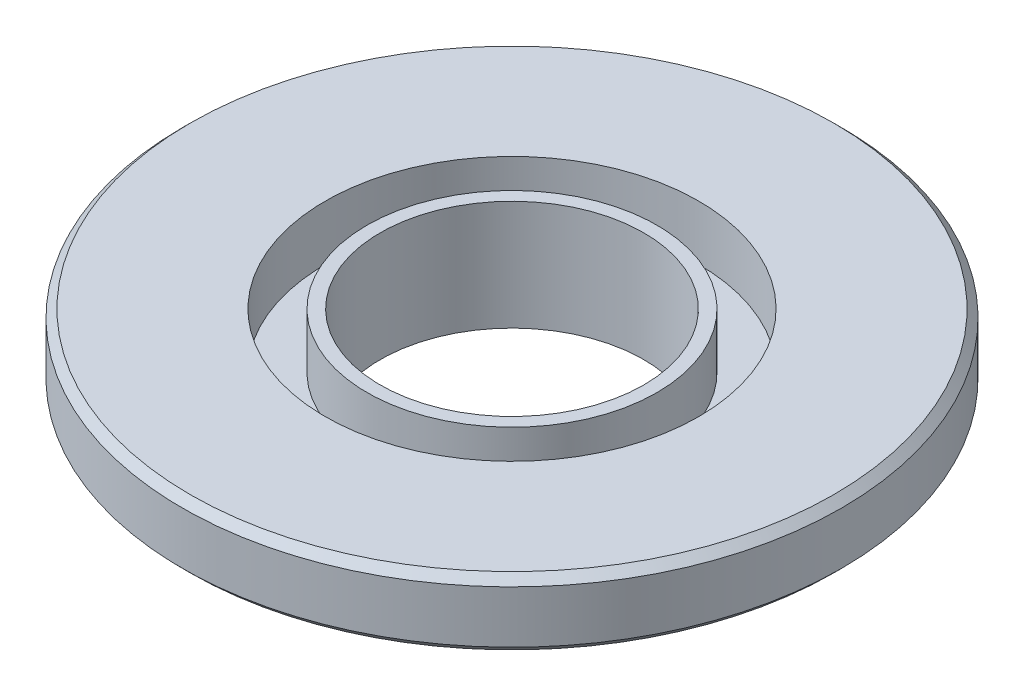
ISO-10303-21;
HEADER;
FILE_DESCRIPTION(('STEP AP214'),'2;1');
FILE_NAME('part.step','',(''),(''),'','','');
FILE_SCHEMA(('AUTOMOTIVE_DESIGN { 1 0 10303 214 1 1 1 1 }'));
ENDSEC;
DATA;
#1=APPLICATION_CONTEXT('core data for automotive mechanical design processes');
#2=APPLICATION_PROTOCOL_DEFINITION('international standard','automotive_design',2000,#1);
#3=PRODUCT_CONTEXT('',#1,'mechanical');
#4=PRODUCT('Part','Part','',(#3));
#5=PRODUCT_RELATED_PRODUCT_CATEGORY('part','',(#4));
#6=PRODUCT_DEFINITION_FORMATION('','',#4);
#7=PRODUCT_DEFINITION_CONTEXT('part definition',#1,'design');
#8=PRODUCT_DEFINITION('design','',#6,#7);
#9=PRODUCT_DEFINITION_SHAPE('','',#8);
#10=(LENGTH_UNIT() NAMED_UNIT(*) SI_UNIT(.MILLI.,.METRE.));
#11=(NAMED_UNIT(*) PLANE_ANGLE_UNIT() SI_UNIT($,.RADIAN.));
#12=(NAMED_UNIT(*) SI_UNIT($,.STERADIAN.) SOLID_ANGLE_UNIT());
#13=UNCERTAINTY_MEASURE_WITH_UNIT(LENGTH_MEASURE(1.E-05),#10,'distance_accuracy_value','');
#14=(GEOMETRIC_REPRESENTATION_CONTEXT(3) GLOBAL_UNCERTAINTY_ASSIGNED_CONTEXT((#13)) GLOBAL_UNIT_ASSIGNED_CONTEXT((#10,
#11,#12)) REPRESENTATION_CONTEXT('',''));
#15=CARTESIAN_POINT('',(0.,0.,0.));
#16=DIRECTION('',(0.,0.,1.));
#17=DIRECTION('',(1.,0.,0.));
#18=AXIS2_PLACEMENT_3D('',#15,#16,#17);
#19=CARTESIAN_POINT('',(0.,-0.1767766952966,0.));
#20=DIRECTION('',(0.,-1.,0.));
#21=DIRECTION('',(-1.,0.,0.));
#22=AXIS2_PLACEMENT_3D('',#19,#20,#21);
#23=CONICAL_SURFACE('',#22,14.8232233047,0.785398163397448);
#24=CARTESIAN_POINT('',(0.,-0.3535533905933,0.));
#25=DIRECTION('',(0.,-1.,0.));
#26=DIRECTION('',(1.,0.,0.));
#27=AXIS2_PLACEMENT_3D('',#24,#25,#26);
#28=CIRCLE('',#27,15.);
#29=CARTESIAN_POINT('',(15.,-0.3535533905933,0.));
#30=VERTEX_POINT('',#29);
#31=EDGE_CURVE('E27',#30,#30,#28,.T.);
#32=ORIENTED_EDGE('',*,*,#31,.F.);
#33=DIRECTION('',(-0.707106781186548,0.707106781186548,0.));
#34=VECTOR('',#33,1.);
#35=CARTESIAN_POINT('',(14.8232233047,-0.1767766952966,0.));
#36=LINE('',#35,#34);
#37=CARTESIAN_POINT('',(14.6464466094067,-3.29299087997725E-12,0.));
#38=VERTEX_POINT('',#37);
#39=EDGE_CURVE('E11',#30,#38,#36,.T.);
#40=ORIENTED_EDGE('',*,*,#39,.T.);
#41=CARTESIAN_POINT('',(0.,0.,0.));
#42=DIRECTION('',(0.,1.,0.));
#43=DIRECTION('',(1.,0.,0.));
#44=AXIS2_PLACEMENT_3D('',#41,#42,#43);
#45=CIRCLE('',#44,14.64644660941);
#46=EDGE_CURVE('E123',#38,#38,#45,.T.);
#47=ORIENTED_EDGE('',*,*,#46,.F.);
#48=ORIENTED_EDGE('',*,*,#39,.F.);
#49=EDGE_LOOP('',(#32,#40,#47,#48));
#50=FACE_BOUND('',#49,.T.);
#51=ADVANCED_FACE('F17',(#50),#23,.T.);
#52=CARTESIAN_POINT('',(0.,0.25,0.));
#53=DIRECTION('',(0.,-1.,0.));
#54=DIRECTION('',(-1.,0.,0.));
#55=AXIS2_PLACEMENT_3D('',#52,#53,#54);
#56=CYLINDRICAL_SURFACE('',#55,15.);
#57=CARTESIAN_POINT('',(0.,-2.731562011664,0.));
#58=DIRECTION('',(0.,-1.,0.));
#59=DIRECTION('',(1.,0.,0.));
#60=AXIS2_PLACEMENT_3D('',#57,#58,#59);
#61=CIRCLE('',#60,15.);
#62=CARTESIAN_POINT('',(-15.,-2.731562011664,0.));
#63=VERTEX_POINT('',#62);
#64=CARTESIAN_POINT('',(15.,-2.731562011664,0.));
#65=VERTEX_POINT('',#64);
#66=EDGE_CURVE('E98',#63,#65,#61,.T.);
#67=ORIENTED_EDGE('',*,*,#66,.F.);
#68=CARTESIAN_POINT('',(0.,-2.731562011664,0.));
#69=DIRECTION('',(0.,-1.,0.));
#70=DIRECTION('',(1.,0.,0.));
#71=AXIS2_PLACEMENT_3D('',#68,#69,#70);
#72=CIRCLE('',#71,15.);
#73=EDGE_CURVE('E92',#65,#63,#72,.T.);
#74=ORIENTED_EDGE('',*,*,#73,.F.);
#75=DIRECTION('',(0.,1.,0.));
#76=VECTOR('',#75,1.);
#77=CARTESIAN_POINT('',(15.,0.25,0.));
#78=LINE('',#77,#76);
#79=EDGE_CURVE('E49',#65,#30,#78,.T.);
#80=ORIENTED_EDGE('',*,*,#79,.T.);
#81=ORIENTED_EDGE('',*,*,#31,.T.);
#82=ORIENTED_EDGE('',*,*,#79,.F.);
#83=EDGE_LOOP('',(#67,#74,#80,#81,#82));
#84=FACE_BOUND('',#83,.T.);
#85=ADVANCED_FACE('F151',(#84),#56,.T.);
#86=CARTESIAN_POINT('',(0.,-2.908338706961,0.));
#87=DIRECTION('',(0.,1.,0.));
#88=DIRECTION('',(1.,0.,0.));
#89=AXIS2_PLACEMENT_3D('',#86,#87,#88);
#90=CONICAL_SURFACE('',#89,14.8232233047,0.785398163397448);
#91=ORIENTED_EDGE('',*,*,#66,.T.);
#92=ORIENTED_EDGE('',*,*,#73,.T.);
#93=DIRECTION('',(0.707106781186548,-0.707106781186548,0.));
#94=VECTOR('',#93,1.);
#95=CARTESIAN_POINT('',(-14.8232233047,-2.908338706961,0.));
#96=LINE('',#95,#94);
#97=CARTESIAN_POINT('',(-14.64644660941,-3.085115402257,0.));
#98=VERTEX_POINT('',#97);
#99=EDGE_CURVE('E88',#63,#98,#96,.T.);
#100=ORIENTED_EDGE('',*,*,#99,.T.);
#101=CARTESIAN_POINT('',(0.,-3.085115402257,0.));
#102=DIRECTION('',(0.,-1.,0.));
#103=DIRECTION('',(1.,0.,0.));
#104=AXIS2_PLACEMENT_3D('',#101,#102,#103);
#105=CIRCLE('',#104,14.64644660941);
#106=EDGE_CURVE('E91',#98,#98,#105,.T.);
#107=ORIENTED_EDGE('',*,*,#106,.F.);
#108=ORIENTED_EDGE('',*,*,#99,.F.);
#109=EDGE_LOOP('',(#91,#92,#100,#107,#108));
#110=FACE_BOUND('',#109,.T.);
#111=ADVANCED_FACE('F90',(#110),#90,.T.);
#112=CARTESIAN_POINT('',(0.,-4.042557701129,0.));
#113=DIRECTION('',(0.,1.,0.));
#114=DIRECTION('',(1.,0.,0.));
#115=AXIS2_PLACEMENT_3D('',#112,#113,#114);
#116=CONICAL_SURFACE('',#115,11.0732233047,1.30899693899575);
#117=ORIENTED_EDGE('',*,*,#106,.T.);
#118=DIRECTION('',(0.965925826289068,-0.258819045102521,0.));
#119=VECTOR('',#118,1.);
#120=CARTESIAN_POINT('',(-11.0732233047,-4.042557701129,0.));
#121=LINE('',#120,#119);
#122=CARTESIAN_POINT('',(-7.5,-5.,0.));
#123=VERTEX_POINT('',#122);
#124=EDGE_CURVE('E80',#98,#123,#121,.T.);
#125=ORIENTED_EDGE('',*,*,#124,.T.);
#126=CARTESIAN_POINT('',(0.,-5.,0.));
#127=DIRECTION('',(0.,-1.,0.));
#128=DIRECTION('',(1.,0.,0.));
#129=AXIS2_PLACEMENT_3D('',#126,#127,#128);
#130=CIRCLE('',#129,7.5);
#131=EDGE_CURVE('E96',#123,#123,#130,.T.);
#132=ORIENTED_EDGE('',*,*,#131,.F.);
#133=ORIENTED_EDGE('',*,*,#124,.F.);
#134=EDGE_LOOP('',(#117,#125,#132,#133));
#135=FACE_BOUND('',#134,.T.);
#136=ADVANCED_FACE('F95',(#135),#116,.T.);
#137=CARTESIAN_POINT('',(0.,-5.,0.));
#138=DIRECTION('',(0.,-1.,0.));
#139=DIRECTION('',(0.,0.,-1.));
#140=AXIS2_PLACEMENT_3D('',#137,#138,#139);
#141=PLANE('',#140);
#142=CARTESIAN_POINT('',(0.,-5.,0.));
#143=DIRECTION('',(0.,-1.,0.));
#144=DIRECTION('',(1.,0.,0.));
#145=AXIS2_PLACEMENT_3D('',#142,#143,#144);
#146=CIRCLE('',#145,6.);
#147=CARTESIAN_POINT('',(6.,-5.,0.));
#148=VERTEX_POINT('',#147);
#149=EDGE_CURVE('E110',#148,#148,#146,.T.);
#150=ORIENTED_EDGE('',*,*,#149,.F.);
#151=EDGE_LOOP('',(#150));
#152=FACE_BOUND('',#151,.T.);
#153=ORIENTED_EDGE('',*,*,#131,.T.);
#154=EDGE_LOOP('',(#153));
#155=FACE_BOUND('',#154,.T.);
#156=ADVANCED_FACE('F19',(#152,#155),#141,.T.);
#157=CARTESIAN_POINT('',(0.,0.25,0.));
#158=DIRECTION('',(0.,-1.,0.));
#159=DIRECTION('',(-1.,0.,0.));
#160=AXIS2_PLACEMENT_3D('',#157,#158,#159);
#161=CYLINDRICAL_SURFACE('',#160,6.);
#162=CARTESIAN_POINT('',(0.,0.,0.));
#163=DIRECTION('',(0.,-1.,0.));
#164=DIRECTION('',(1.,0.,0.));
#165=AXIS2_PLACEMENT_3D('',#162,#163,#164);
#166=CIRCLE('',#165,6.);
#167=CARTESIAN_POINT('',(6.,0.,0.));
#168=VERTEX_POINT('',#167);
#169=EDGE_CURVE('E190',#168,#168,#166,.T.);
#170=ORIENTED_EDGE('',*,*,#169,.F.);
#171=DIRECTION('',(0.,-1.,0.));
#172=VECTOR('',#171,1.);
#173=CARTESIAN_POINT('',(6.,0.25,0.));
#174=LINE('',#173,#172);
#175=EDGE_CURVE('E113',#168,#148,#174,.T.);
#176=ORIENTED_EDGE('',*,*,#175,.T.);
#177=ORIENTED_EDGE('',*,*,#149,.T.);
#178=ORIENTED_EDGE('',*,*,#175,.F.);
#179=EDGE_LOOP('',(#170,#176,#177,#178));
#180=FACE_BOUND('',#179,.T.);
#181=ADVANCED_FACE('F139',(#180),#161,.F.);
#182=CARTESIAN_POINT('',(0.,0.,0.));
#183=DIRECTION('',(0.,-1.,0.));
#184=DIRECTION('',(0.,0.,-1.));
#185=AXIS2_PLACEMENT_3D('',#182,#183,#184);
#186=PLANE('',#185);
#187=ORIENTED_EDGE('',*,*,#169,.T.);
#188=EDGE_LOOP('',(#187));
#189=FACE_BOUND('',#188,.T.);
#190=CARTESIAN_POINT('',(0.,0.,0.));
#191=DIRECTION('',(0.,-1.,0.));
#192=DIRECTION('',(1.,0.,0.));
#193=AXIS2_PLACEMENT_3D('',#190,#191,#192);
#194=CIRCLE('',#193,6.6);
#195=CARTESIAN_POINT('',(6.6,0.,0.));
#196=VERTEX_POINT('',#195);
#197=EDGE_CURVE('E188',#196,#196,#194,.T.);
#198=ORIENTED_EDGE('',*,*,#197,.F.);
#199=EDGE_LOOP('',(#198));
#200=FACE_BOUND('',#199,.T.);
#201=ADVANCED_FACE('F146',(#189,#200),#186,.F.);
#202=CARTESIAN_POINT('',(0.,0.25,0.));
#203=DIRECTION('',(0.,-1.,0.));
#204=DIRECTION('',(-1.,0.,0.));
#205=AXIS2_PLACEMENT_3D('',#202,#203,#204);
#206=CYLINDRICAL_SURFACE('',#205,6.6);
#207=CARTESIAN_POINT('',(0.,-2.5,0.));
#208=DIRECTION('',(0.,-1.,0.));
#209=DIRECTION('',(1.,0.,0.));
#210=AXIS2_PLACEMENT_3D('',#207,#208,#209);
#211=CIRCLE('',#210,6.6);
#212=CARTESIAN_POINT('',(6.6,-2.5,0.));
#213=VERTEX_POINT('',#212);
#214=EDGE_CURVE('E21',#213,#213,#211,.T.);
#215=ORIENTED_EDGE('',*,*,#214,.F.);
#216=DIRECTION('',(0.,1.,0.));
#217=VECTOR('',#216,1.);
#218=CARTESIAN_POINT('',(6.6,0.25,0.));
#219=LINE('',#218,#217);
#220=EDGE_CURVE('E132',#213,#196,#219,.T.);
#221=ORIENTED_EDGE('',*,*,#220,.T.);
#222=ORIENTED_EDGE('',*,*,#197,.T.);
#223=ORIENTED_EDGE('',*,*,#220,.F.);
#224=EDGE_LOOP('',(#215,#221,#222,#223));
#225=FACE_BOUND('',#224,.T.);
#226=ADVANCED_FACE('F164',(#225),#206,.T.);
#227=CARTESIAN_POINT('',(0.,-2.5,0.));
#228=DIRECTION('',(0.,-1.,0.));
#229=DIRECTION('',(0.,0.,-1.));
#230=AXIS2_PLACEMENT_3D('',#227,#228,#229);
#231=PLANE('',#230);
#232=ORIENTED_EDGE('',*,*,#214,.T.);
#233=EDGE_LOOP('',(#232));
#234=FACE_BOUND('',#233,.T.);
#235=CARTESIAN_POINT('',(0.,-2.5,0.));
#236=DIRECTION('',(0.,-1.,0.));
#237=DIRECTION('',(1.,0.,0.));
#238=AXIS2_PLACEMENT_3D('',#235,#236,#237);
#239=CIRCLE('',#238,8.5);
#240=CARTESIAN_POINT('',(8.5,-2.5,0.));
#241=VERTEX_POINT('',#240);
#242=EDGE_CURVE('E114',#241,#241,#239,.T.);
#243=ORIENTED_EDGE('',*,*,#242,.F.);
#244=EDGE_LOOP('',(#243));
#245=FACE_BOUND('',#244,.T.);
#246=ADVANCED_FACE('F160',(#234,#245),#231,.F.);
#247=CARTESIAN_POINT('',(0.,0.25,0.));
#248=DIRECTION('',(0.,-1.,0.));
#249=DIRECTION('',(-1.,0.,0.));
#250=AXIS2_PLACEMENT_3D('',#247,#248,#249);
#251=CYLINDRICAL_SURFACE('',#250,8.5);
#252=CARTESIAN_POINT('',(0.,0.,0.));
#253=DIRECTION('',(0.,-1.,0.));
#254=DIRECTION('',(1.,0.,0.));
#255=AXIS2_PLACEMENT_3D('',#252,#253,#254);
#256=CIRCLE('',#255,8.5);
#257=CARTESIAN_POINT('',(8.5,0.,0.));
#258=VERTEX_POINT('',#257);
#259=EDGE_CURVE('E119',#258,#258,#256,.T.);
#260=ORIENTED_EDGE('',*,*,#259,.F.);
#261=DIRECTION('',(0.,-1.,0.));
#262=VECTOR('',#261,1.);
#263=CARTESIAN_POINT('',(8.5,0.25,0.));
#264=LINE('',#263,#262);
#265=EDGE_CURVE('E117',#258,#241,#264,.T.);
#266=ORIENTED_EDGE('',*,*,#265,.T.);
#267=ORIENTED_EDGE('',*,*,#242,.T.);
#268=ORIENTED_EDGE('',*,*,#265,.F.);
#269=EDGE_LOOP('',(#260,#266,#267,#268));
#270=FACE_BOUND('',#269,.T.);
#271=ADVANCED_FACE('F163',(#270),#251,.F.);
#272=CARTESIAN_POINT('',(0.,0.,0.));
#273=DIRECTION('',(0.,-1.,0.));
#274=DIRECTION('',(0.,0.,-1.));
#275=AXIS2_PLACEMENT_3D('',#272,#273,#274);
#276=PLANE('',#275);
#277=ORIENTED_EDGE('',*,*,#259,.T.);
#278=EDGE_LOOP('',(#277));
#279=FACE_BOUND('',#278,.T.);
#280=ORIENTED_EDGE('',*,*,#46,.T.);
#281=EDGE_LOOP('',(#280));
#282=FACE_BOUND('',#281,.T.);
#283=ADVANCED_FACE('F174',(#279,#282),#276,.F.);
#284=CLOSED_SHELL('',(#51,#85,#111,#136,#156,#181,#201,#226,#246,#271,#283));
#285=MANIFOLD_SOLID_BREP('B1',#284);
#286=ADVANCED_BREP_SHAPE_REPRESENTATION('',(#18,#285),#14);
#287=SHAPE_DEFINITION_REPRESENTATION(#9,#286);
ENDSEC;
END-ISO-10303-21;
